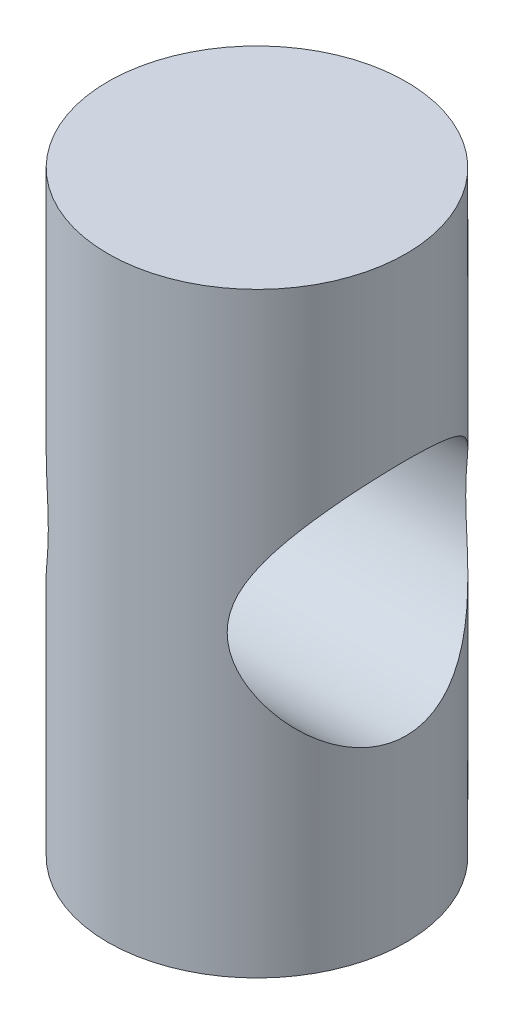
ISO-10303-21;
HEADER;
FILE_DESCRIPTION(('STEP AP214'),'2;1');
FILE_NAME('part.step','',(''),(''),'','','');
FILE_SCHEMA(('AUTOMOTIVE_DESIGN { 1 0 10303 214 1 1 1 1 }'));
ENDSEC;
DATA;
#1=APPLICATION_CONTEXT('core data for automotive mechanical design processes');
#2=APPLICATION_PROTOCOL_DEFINITION('international standard','automotive_design',2000,#1);
#3=PRODUCT_CONTEXT('',#1,'mechanical');
#4=PRODUCT('Part','Part','',(#3));
#5=PRODUCT_RELATED_PRODUCT_CATEGORY('part','',(#4));
#6=PRODUCT_DEFINITION_FORMATION('','',#4);
#7=PRODUCT_DEFINITION_CONTEXT('part definition',#1,'design');
#8=PRODUCT_DEFINITION('design','',#6,#7);
#9=PRODUCT_DEFINITION_SHAPE('','',#8);
#10=(LENGTH_UNIT() NAMED_UNIT(*) SI_UNIT(.MILLI.,.METRE.));
#11=(NAMED_UNIT(*) PLANE_ANGLE_UNIT() SI_UNIT($,.RADIAN.));
#12=(NAMED_UNIT(*) SI_UNIT($,.STERADIAN.) SOLID_ANGLE_UNIT());
#13=UNCERTAINTY_MEASURE_WITH_UNIT(LENGTH_MEASURE(1.E-05),#10,'distance_accuracy_value','');
#14=(GEOMETRIC_REPRESENTATION_CONTEXT(3) GLOBAL_UNCERTAINTY_ASSIGNED_CONTEXT((#13)) GLOBAL_UNIT_ASSIGNED_CONTEXT((#10,
#11,#12)) REPRESENTATION_CONTEXT('',''));
#15=CARTESIAN_POINT('',(0.,0.,0.));
#16=DIRECTION('',(0.,0.,1.));
#17=DIRECTION('',(1.,0.,0.));
#18=AXIS2_PLACEMENT_3D('',#15,#16,#17);
#19=CARTESIAN_POINT('',(0.,20.,0.));
#20=DIRECTION('',(0.,-1.,0.));
#21=DIRECTION('',(0.,0.,-1.));
#22=AXIS2_PLACEMENT_3D('',#19,#20,#21);
#23=CYLINDRICAL_SURFACE('',#22,5.);
#24=CARTESIAN_POINT('',(0.,20.,0.));
#25=DIRECTION('',(0.,1.,0.));
#26=DIRECTION('',(0.,0.,1.));
#27=AXIS2_PLACEMENT_3D('',#24,#25,#26);
#28=CIRCLE('',#27,5.);
#29=CARTESIAN_POINT('',(0.,20.,5.));
#30=VERTEX_POINT('',#29);
#31=EDGE_CURVE('E52',#30,#30,#28,.T.);
#32=ORIENTED_EDGE('',*,*,#31,.F.);
#33=EDGE_LOOP('',(#32));
#34=FACE_BOUND('',#33,.T.);
#35=CARTESIAN_POINT('',(0.,0.,0.));
#36=DIRECTION('',(0.,1.,0.));
#37=DIRECTION('',(0.,0.,1.));
#38=AXIS2_PLACEMENT_3D('',#35,#36,#37);
#39=CIRCLE('',#38,5.);
#40=CARTESIAN_POINT('',(0.,0.,5.));
#41=VERTEX_POINT('',#40);
#42=EDGE_CURVE('E56',#41,#41,#39,.T.);
#43=ORIENTED_EDGE('',*,*,#42,.T.);
#44=EDGE_LOOP('',(#43));
#45=FACE_BOUND('',#44,.T.);
#46=CARTESIAN_POINT('',(-3.,10.,4.));
#47=CARTESIAN_POINT('',(-3.00000216897706,10.0751127638724,3.99999906153736));
#48=CARTESIAN_POINT('',(-3.00283772099951,10.1502548783052,3.9978772461753));
#49=CARTESIAN_POINT('',(-3.01402583978567,10.2999085668623,3.9894472679785));
#50=CARTESIAN_POINT('',(-3.0223821685803,10.3744196759087,3.98313625047582));
#51=CARTESIAN_POINT('',(-3.05522921920833,10.5964792669388,3.95807727295162));
#52=CARTESIAN_POINT('',(-3.08749551829531,10.7422441090253,3.93320424396426));
#53=CARTESIAN_POINT('',(-3.18155216304268,11.0752679296061,3.85777127536566));
#54=CARTESIAN_POINT('',(-3.24971322017135,11.259280762929,3.80127986277753));
#55=CARTESIAN_POINT('',(-3.40189644530756,11.6119405436592,3.66572012951488));
#56=CARTESIAN_POINT('',(-3.48596308623154,11.7805423920404,3.58658817896458));
#57=CARTESIAN_POINT('',(-3.63299455510025,12.0511025805113,3.43637278534429));
#58=CARTESIAN_POINT('',(-3.69414368347801,12.1571725729423,3.37076459378184));
#59=CARTESIAN_POINT('',(-3.81759266309352,12.3623609148689,3.23028207033377));
#60=CARTESIAN_POINT('',(-3.87989292049062,12.4614767491437,3.15540441260616));
#61=CARTESIAN_POINT('',(-4.00378958470973,12.6524698551693,2.99663184861433));
#62=CARTESIAN_POINT('',(-4.06538665380558,12.7443545190937,2.91274636380755));
#63=CARTESIAN_POINT('',(-4.1863923788989,12.9206130185108,2.73598294461542));
#64=CARTESIAN_POINT('',(-4.24580074475847,13.0049858603096,2.64310382389854));
#65=CARTESIAN_POINT('',(-4.39576497816678,13.2141641345422,2.38958702931893));
#66=CARTESIAN_POINT('',(-4.48348070331291,13.3326403995927,2.22188522507707));
#67=CARTESIAN_POINT('',(-4.64331594269541,13.5447440666598,1.86487183658862));
#68=CARTESIAN_POINT('',(-4.71545966061736,13.6384100836688,1.67559449748563));
#69=CARTESIAN_POINT('',(-4.82831023596969,13.7834234169018,1.3106378083364));
#70=CARTESIAN_POINT('',(-4.87221400973622,13.8391644582378,1.13770814774397));
#71=CARTESIAN_POINT('',(-4.94171895740111,13.9269980610548,0.782375130146827));
#72=CARTESIAN_POINT('',(-4.96733014065903,13.9591035557558,0.599977012805128));
#73=CARTESIAN_POINT('',(-4.99815918603462,13.9977160060242,0.230096932996539));
#74=CARTESIAN_POINT('',(-5.00330644418758,14.0041343370861,0.0425996130134308));
#75=CARTESIAN_POINT('',(-4.99253877415278,13.9906715785491,-0.330832803126787));
#76=CARTESIAN_POINT('',(-4.97662287125135,13.9707892718684,-0.516767826586739));
#77=CARTESIAN_POINT('',(-4.92656730161909,13.9078640154556,-0.871367119528871));
#78=CARTESIAN_POINT('',(-4.89346809374314,13.8661423628863,-1.04042037317327));
#79=CARTESIAN_POINT('',(-4.81208987661318,13.7626095346981,-1.36834372900708));
#80=CARTESIAN_POINT('',(-4.76380703714184,13.7007932898918,-1.52721124956009));
#81=CARTESIAN_POINT('',(-4.6497244388944,13.5527986018509,-1.84705463504236));
#82=CARTESIAN_POINT('',(-4.58268531292501,13.4648469677435,-2.00675938549036));
#83=CARTESIAN_POINT('',(-4.43788087321013,13.2709242810442,-2.30941782762204));
#84=CARTESIAN_POINT('',(-4.36010955958914,13.1649431412106,-2.4523620660043));
#85=CARTESIAN_POINT('',(-4.18107021951004,12.9138762624791,-2.7485304270312));
#86=CARTESIAN_POINT('',(-4.07826288579636,12.7652327722589,-2.89780217491636));
#87=CARTESIAN_POINT('',(-3.8698475585256,12.4474881920297,-3.17076769972647));
#88=CARTESIAN_POINT('',(-3.76423628533182,12.2783622400501,-3.29442988804259));
#89=CARTESIAN_POINT('',(-3.56882635257453,11.9375596107156,-3.50457057042853));
#90=CARTESIAN_POINT('',(-3.47848449125888,11.7676981273778,-3.59348348213152));
#91=CARTESIAN_POINT('',(-3.311642115282,11.411267058945,-3.74778213755155));
#92=CARTESIAN_POINT('',(-3.23511152965085,11.2247351281576,-3.81321930924474));
#93=CARTESIAN_POINT('',(-3.12787610334288,10.8944168136814,-3.90124400044661));
#94=CARTESIAN_POINT('',(-3.09031204063763,10.754774407918,-3.93080589266452));
#95=CARTESIAN_POINT('',(-3.03334609209689,10.4696395185338,-3.97493954411983));
#96=CARTESIAN_POINT('',(-3.01390372218814,10.3241608358987,-3.98954472407251));
#97=CARTESIAN_POINT('',(-2.99655581152985,10.0302735019019,-4.00259995644497));
#98=CARTESIAN_POINT('',(-2.99877509004065,9.88185279352365,-4.00095637919488));
#99=CARTESIAN_POINT('',(-3.0246091025562,9.58790438492497,-3.98145195095297));
#100=CARTESIAN_POINT('',(-3.04825402601149,9.44238106298878,-3.96356821696024));
#101=CARTESIAN_POINT('',(-3.12103026774741,9.12187811577489,-3.90662980025043));
#102=CARTESIAN_POINT('',(-3.17511484339329,8.94882232992988,-3.86334682887901));
#103=CARTESIAN_POINT('',(-3.30045577188711,8.61539934501899,-3.7568227830305));
#104=CARTESIAN_POINT('',(-3.3717631685811,8.45507178166204,-3.69352220593005));
#105=CARTESIAN_POINT('',(-3.50285579501049,8.18907447789113,-3.56873529200273));
#106=CARTESIAN_POINT('',(-3.56053707787215,8.08035469635564,-3.5113936535288));
#107=CARTESIAN_POINT('',(-3.67845509899156,7.86958262020671,-3.38766369294498));
#108=CARTESIAN_POINT('',(-3.73869287952637,7.76753308895223,-3.32127165613201));
#109=CARTESIAN_POINT('',(-3.859872019447,7.57004388124776,-3.17963685728911));
#110=CARTESIAN_POINT('',(-3.92081401406668,7.4746108221193,-3.10438543197556));
#111=CARTESIAN_POINT('',(-4.04175247615808,7.29065278420014,-2.9452042144371));
#112=CARTESIAN_POINT('',(-4.10174909000274,7.20212672744487,-2.86127578119157));
#113=CARTESIAN_POINT('',(-4.22021627080502,7.03114906047696,-2.68353213742299));
#114=CARTESIAN_POINT('',(-4.27865261127786,6.94880277661424,-2.5895923964421));
#115=CARTESIAN_POINT('',(-4.39166054074384,6.79225720510719,-2.39294409088257));
#116=CARTESIAN_POINT('',(-4.44623152443021,6.71805919246809,-2.2902341584402));
#117=CARTESIAN_POINT('',(-4.54992450745379,6.5788949795032,-2.07659269983667));
#118=CARTESIAN_POINT('',(-4.59906106720031,6.51390397270302,-1.96568453999991));
#119=CARTESIAN_POINT('',(-4.69058814238978,6.39401717542559,-1.73599312724423));
#120=CARTESIAN_POINT('',(-4.73298247555986,6.33911566909704,-1.61721438534432));
#121=CARTESIAN_POINT('',(-4.82322056507458,6.22306583384218,-1.3291396214626));
#122=CARTESIAN_POINT('',(-4.86768700006943,6.16657783874109,-1.15683679137341));
#123=CARTESIAN_POINT('',(-4.93844243001732,6.07712314701222,-0.802710516835248));
#124=CARTESIAN_POINT('',(-4.96474530068643,6.04413849482907,-0.620894454329593));
#125=CARTESIAN_POINT('',(-4.99709091896648,6.00361774014065,-0.251928169863223));
#126=CARTESIAN_POINT('',(-5.00305974169112,5.99617449327453,-0.0647609739930188));
#127=CARTESIAN_POINT('',(-4.99397521901685,6.00753211507581,0.308260451752381));
#128=CARTESIAN_POINT('',(-4.97892039336181,6.02633483169779,0.494114588250199));
#129=CARTESIAN_POINT('',(-4.9304799780731,6.08720730726,0.848969594728801));
#130=CARTESIAN_POINT('',(-4.89811800019639,6.12797868293325,1.01834018003764));
#131=CARTESIAN_POINT('',(-4.81810404518646,6.2297068224953,1.34704122291859));
#132=CARTESIAN_POINT('',(-4.77044810811758,6.2906688143008,1.50636906741201));
#133=CARTESIAN_POINT('',(-4.65772424604643,6.43674894379435,1.82676698607757));
#134=CARTESIAN_POINT('',(-4.59144870858767,6.52358705321838,1.98661951413852));
#135=CARTESIAN_POINT('',(-4.44806715123531,6.7152853055309,2.28972858505142));
#136=CARTESIAN_POINT('',(-4.37095538500458,6.82015501702622,2.43297624848929));
#137=CARTESIAN_POINT('',(-4.19334053560393,7.06858955779301,2.72976152486729));
#138=CARTESIAN_POINT('',(-4.09128024292157,7.21568109587433,2.87940400752525));
#139=CARTESIAN_POINT('',(-3.8840119778562,7.53024559529154,3.15339914395294));
#140=CARTESIAN_POINT('',(-3.77880023252429,7.69774378848213,3.2777199709751));
#141=CARTESIAN_POINT('',(-3.62927982065267,7.95646536311241,3.43993958125246));
#142=CARTESIAN_POINT('',(-3.58277064491091,8.04001997010147,3.48824759185101));
#143=CARTESIAN_POINT('',(-3.49198784457615,8.21135259007398,3.57912761543908));
#144=CARTESIAN_POINT('',(-3.44771451944073,8.29913116573425,3.62169886134499));
#145=CARTESIAN_POINT('',(-3.32016981870037,8.56867868407035,3.74029659813686));
#146=CARTESIAN_POINT('',(-3.24192092894644,8.75707516713469,3.80747088284747));
#147=CARTESIAN_POINT('',(-3.13160451168613,9.09233806168124,3.89828691275497));
#148=CARTESIAN_POINT('',(-3.09272315846936,9.23498946694964,3.92892882070587));
#149=CARTESIAN_POINT('',(-3.04855095693216,9.45340832619082,3.96316402261263));
#150=CARTESIAN_POINT('',(-3.03619187391989,9.52685989967015,3.97261660358216));
#151=CARTESIAN_POINT('',(-3.01668227593599,9.67483847109559,3.98745340408319));
#152=CARTESIAN_POINT('',(-3.00952811408349,9.74936467867818,3.99284047225642));
#153=CARTESIAN_POINT('',(-3.00343793345697,9.85338182067805,3.99741959341137));
#154=CARTESIAN_POINT('',(-3.00215019354812,9.88267880661877,3.99838660813179));
#155=CARTESIAN_POINT('',(-3.00043074741308,9.94131569844635,3.99967703663994));
#156=CARTESIAN_POINT('',(-2.99999915264322,9.97065560942388,4.00000036663029));
#157=CARTESIAN_POINT('',(-3.,10.,4.));
#158=B_SPLINE_CURVE_WITH_KNOTS('',3,(#46,#47,#48,#49,#50,#51,#52,#53,#54,#55,#56,#57,#58,#59,
#60,#61,#62,#63,#64,#65,#66,#67,#68,#69,#70,#71,#72,#73,#74,#75,#76,#77,#78,#79,#80,#81,#82,#83,
#84,#85,#86,#87,#88,#89,#90,#91,#92,#93,#94,#95,#96,#97,#98,#99,#100,#101,#102,#103,#104,#105,
#106,#107,#108,#109,#110,#111,#112,#113,#114,#115,#116,#117,#118,#119,#120,#121,#122,#123,#124,
#125,#126,#127,#128,#129,#130,#131,#132,#133,#134,#135,#136,#137,#138,#139,#140,#141,#142,#143,
#144,#145,#146,#147,#148,#149,#150,#151,#152,#153,#154,#155,#156,#157),.UNSPECIFIED.,.T.,.F.,(4,
2,2,2,2,2,2,2,2,2,2,2,2,2,2,2,2,2,2,2,2,2,2,2,2,2,2,2,2,2,2,2,2,2,2,2,2,2,2,2,2,2,2,2,2,2,2,2,2,
2,2,2,2,2,2,4),(0.,0.225303149807231,0.450759986838272,0.902589537001555,1.51190711853316,
2.12295426111056,2.53921883623536,2.95563320042537,3.37161619465101,3.78765413525724,
4.45477512810166,5.12085162154028,5.67923095322337,6.23730451573862,6.79730186307842,
7.35732512562407,7.88682741454582,8.41646338281239,8.99711927828841,9.57810111704287,
10.2788135954479,10.9803852999411,11.6143729322192,12.2469630912607,12.6881435902171,
13.1283361077291,13.5710666035102,14.0144218930567,14.5705602720657,15.1283675704704,
15.5352238321967,15.942247592246,16.3496727250838,16.7570341440244,17.1702378198689,
17.5835060601354,17.9956387441516,18.4075372242806,18.9651425713466,19.5223214735685,
20.0815238628587,20.6407656270703,21.1700928587455,21.6995572553744,22.2782911959238,
22.8573331992423,23.5548944002191,24.2533270266164,24.5745079263911,24.8957317299052,
25.5365329660934,25.9876445768306,26.2126360623764,26.4374697531347,26.5254777394982,
26.6134971823349),.UNSPECIFIED.);
#159=CARTESIAN_POINT('',(-3.,10.,4.));
#160=VERTEX_POINT('',#159);
#161=EDGE_CURVE('E48',#160,#160,#158,.T.);
#162=ORIENTED_EDGE('',*,*,#161,.F.);
#163=EDGE_LOOP('',(#162));
#164=FACE_BOUND('',#163,.T.);
#165=CARTESIAN_POINT('',(5.,6.,0.));
#166=CARTESIAN_POINT('',(4.99999925007144,6.00000076765392,-0.0960463892269616));
#167=CARTESIAN_POINT('',(4.99722609178681,6.00346570128462,-0.192107536101775));
#168=CARTESIAN_POINT('',(4.98619644135893,6.01726581879289,-0.383456997959251));
#169=CARTESIAN_POINT('',(4.97793704739464,6.02760463846066,-0.478744876926666));
#170=CARTESIAN_POINT('',(4.95610616327994,6.05499588301476,-0.667896097153801));
#171=CARTESIAN_POINT('',(4.94252601634641,6.07205924889984,-0.761756856675558));
#172=CARTESIAN_POINT('',(4.91036147054021,6.11261018696222,-0.947221840714973));
#173=CARTESIAN_POINT('',(4.89177480177176,6.13610067319362,-1.0388250210609));
#174=CARTESIAN_POINT('',(4.82935106483283,6.21533299425757,-1.30807557979516));
#175=CARTESIAN_POINT('',(4.77867586050698,6.28005103387382,-1.48159866642755));
#176=CARTESIAN_POINT('',(4.66270676226574,6.43025035599326,-1.81389737735533));
#177=CARTESIAN_POINT('',(4.59741282203946,6.51573170427287,-1.97267295492965));
#178=CARTESIAN_POINT('',(4.47912821132765,6.67368686451008,-2.2248639292531));
#179=CARTESIAN_POINT('',(4.42904400352648,6.74134736434557,-2.32274021976622));
#180=CARTESIAN_POINT('',(4.3251620211011,6.88400573391444,-2.51087921896427));
#181=CARTESIAN_POINT('',(4.2713642727544,6.95900355172956,-2.60114198151347));
#182=CARTESIAN_POINT('',(4.16107388762878,7.1159636745199,-2.77417073320715));
#183=CARTESIAN_POINT('',(4.10457375863138,7.1979459007938,-2.85691378598488));
#184=CARTESIAN_POINT('',(3.99026026433187,7.36823979836874,-3.01451382114098));
#185=CARTESIAN_POINT('',(3.93244741410357,7.45654901548431,-3.08937383375154));
#186=CARTESIAN_POINT('',(3.81587933402462,7.64074063185359,-3.23229007730866));
#187=CARTESIAN_POINT('',(3.75712363418718,7.73672057263845,-3.30022025313705));
#188=CARTESIAN_POINT('',(3.64112939088146,7.93498324744234,-3.42776995071922));
#189=CARTESIAN_POINT('',(3.58389133165286,8.03726795934745,-3.48738684516028));
#190=CARTESIAN_POINT('',(3.47300406561232,8.247927510792,-3.59782503741137));
#191=CARTESIAN_POINT('',(3.41934539082209,8.35628476493175,-3.64867015372864));
#192=CARTESIAN_POINT('',(3.31787465098284,8.57938269970485,-3.74117870293954));
#193=CARTESIAN_POINT('',(3.27005760650691,8.69411782069289,-3.78284998029722));
#194=CARTESIAN_POINT('',(3.17670210665408,8.94771042607503,-3.86171422877733));
#195=CARTESIAN_POINT('',(3.1325716319431,9.08761069930919,-3.89730775139992));
#196=CARTESIAN_POINT('',(3.06140069934777,9.37443811329645,-3.95346969661508));
#197=CARTESIAN_POINT('',(3.03431824876937,9.52134702148413,-3.97407505769532));
#198=CARTESIAN_POINT('',(3.00168390937591,9.82038133127045,-3.99879637912877));
#199=CARTESIAN_POINT('',(2.99632180499322,9.97254104739483,-4.00276700147493));
#200=CARTESIAN_POINT('',(3.00879937970708,10.2754117079388,-3.99338954471176));
#201=CARTESIAN_POINT('',(3.02665869488164,10.4261213175347,-3.98002680850315));
#202=CARTESIAN_POINT('',(3.08641470165092,10.7444399948995,-3.93390695839724));
#203=CARTESIAN_POINT('',(3.13163820874367,10.9109987003219,-3.89843994454065));
#204=CARTESIAN_POINT('',(3.23994782689821,11.2330884824285,-3.8088871552876));
#205=CARTESIAN_POINT('',(3.30308674578672,11.388585232108,-3.75474623305131));
#206=CARTESIAN_POINT('',(3.42227632742624,11.6497837139866,-3.6459308316069));
#207=CARTESIAN_POINT('',(3.4760534543827,11.7581007886366,-3.59488537286134));
#208=CARTESIAN_POINT('',(3.5870318510308,11.9684490944712,-3.48415594475936));
#209=CARTESIAN_POINT('',(3.64423469607952,12.0704773892381,-3.42446798287777));
#210=CARTESIAN_POINT('',(3.76020626520278,12.2683872018107,-3.29671153239115));
#211=CARTESIAN_POINT('',(3.81897674116778,12.3642613966168,-3.22863333111246));
#212=CARTESIAN_POINT('',(3.93645333893041,12.5496673500319,-3.08431402129276));
#213=CARTESIAN_POINT('',(3.99515946971116,12.639200147583,-3.00807425506497));
#214=CARTESIAN_POINT('',(4.11270704931929,12.8140101235963,-2.84534419554463));
#215=CARTESIAN_POINT('',(4.17150999123006,12.8991090406098,-2.75863401138672));
#216=CARTESIAN_POINT('',(4.28625477779832,13.0619130937561,-2.57673993184819));
#217=CARTESIAN_POINT('',(4.34219619990716,13.1396171393685,-2.48155479066094));
#218=CARTESIAN_POINT('',(4.44974832295432,13.2867573053731,-2.28307653193498));
#219=CARTESIAN_POINT('',(4.50136864734377,13.3562119507816,-2.17980247969448));
#220=CARTESIAN_POINT('',(4.59904750487202,13.4861249415168,-1.96536649556131));
#221=CARTESIAN_POINT('',(4.64510854627346,13.5465873468848,-1.85420815715068));
#222=CARTESIAN_POINT('',(4.7484549444979,13.6810867237149,-1.5756005587103));
#223=CARTESIAN_POINT('',(4.80222795480343,13.7500220999001,-1.40425498615803));
#224=CARTESIAN_POINT('',(4.86955008764638,13.8357293521389,-1.13837354893344));
#225=CARTESIAN_POINT('',(4.8897706493769,13.8613525356034,-1.04825004232709));
#226=CARTESIAN_POINT('',(4.92539137425732,13.9063630582772,-0.865540559816896));
#227=CARTESIAN_POINT('',(4.94079379010376,13.9257533117745,-0.772955756713173));
#228=CARTESIAN_POINT('',(4.96651844615635,13.9580805109284,-0.585412597793517));
#229=CARTESIAN_POINT('',(4.97681103690025,13.9709797988717,-0.490443672775502));
#230=CARTESIAN_POINT('',(4.99194513088726,13.9899309236985,-0.299430031813101));
#231=CARTESIAN_POINT('',(4.99678887106583,13.9959855705412,-0.203385773695788));
#232=CARTESIAN_POINT('',(5.00091325383537,14.0011418998756,-0.0109789194594068));
#233=CARTESIAN_POINT('',(5.00019354569613,14.0002431440118,0.0853836963467356));
#234=CARTESIAN_POINT('',(4.9932177293551,13.9915194220691,0.277564076275664));
#235=CARTESIAN_POINT('',(4.9869619042872,13.9836948101995,0.373381868010197));
#236=CARTESIAN_POINT('',(4.96153018407961,13.9518293985393,0.643376202108306));
#237=CARTESIAN_POINT('',(4.93592517140712,13.9197003154007,0.816090326301517));
#238=CARTESIAN_POINT('',(4.86835214152081,13.8342569725143,1.15270281500897));
#239=CARTESIAN_POINT('',(4.82637926825896,13.7809364255526,1.31659854682907));
#240=CARTESIAN_POINT('',(4.72579643945096,13.6516988659432,1.64246254984513));
#241=CARTESIAN_POINT('',(4.66631810673483,13.5745883227446,1.80368475821043));
#242=CARTESIAN_POINT('',(4.53567260245268,13.4022758020823,2.11082248971804));
#243=CARTESIAN_POINT('',(4.4645048479924,13.3070729224052,2.25673724895787));
#244=CARTESIAN_POINT('',(4.29987369953562,13.0815513267087,2.55850389863));
#245=CARTESIAN_POINT('',(4.20473938172851,12.9479966072965,2.71101415405668));
#246=CARTESIAN_POINT('',(4.00886997355526,12.6612260866735,2.99307397629789));
#247=CARTESIAN_POINT('',(3.90811942507611,12.5079543318471,3.1225555991596));
#248=CARTESIAN_POINT('',(3.74748270315101,12.2471311101696,3.31136973153524));
#249=CARTESIAN_POINT('',(3.68709486880245,12.1452788111765,3.37827483148951));
#250=CARTESIAN_POINT('',(3.56870831535753,11.9347554845189,3.50310004274981));
#251=CARTESIAN_POINT('',(3.51071087553711,11.8260808822575,3.5610153876826));
#252=CARTESIAN_POINT('',(3.39966227027329,11.602221488468,3.66717546897681));
#253=CARTESIAN_POINT('',(3.34659439233027,11.4870609917569,3.71545356957107));
#254=CARTESIAN_POINT('',(3.24818077497366,11.2499190098446,3.80178930968629));
#255=CARTESIAN_POINT('',(3.20282553589751,11.1279461651776,3.83985955607521));
#256=CARTESIAN_POINT('',(3.12038840866386,10.8678265775587,3.90720331142187));
#257=CARTESIAN_POINT('',(3.08419433480729,10.7291546803849,3.93559119413991));
#258=CARTESIAN_POINT('',(3.02986743136531,10.4463247642843,3.9775781127465));
#259=CARTESIAN_POINT('',(3.01168904830204,10.3021815440949,3.9912144566024));
#260=CARTESIAN_POINT('',(2.99649473343137,10.0113026041562,4.00264117924986));
#261=CARTESIAN_POINT('',(2.9995925091774,9.86455714184094,4.00034641568718));
#262=CARTESIAN_POINT('',(3.02661544312574,9.574031563725,3.97993037076082));
#263=CARTESIAN_POINT('',(3.05057362163064,9.43025651940554,3.96178399745347));
#264=CARTESIAN_POINT('',(3.12414149092464,9.1107866882603,3.90415501142106));
#265=CARTESIAN_POINT('',(3.17898498230063,8.93715483124829,3.86018501383219));
#266=CARTESIAN_POINT('',(3.3057783394867,8.60273204343612,3.75216313748641));
#267=CARTESIAN_POINT('',(3.37777844742744,8.44198071561927,3.68805209792862));
#268=CARTESIAN_POINT('',(3.50982146216506,8.17564971618661,3.56189718857294));
#269=CARTESIAN_POINT('',(3.56777397494364,8.06697526240992,3.50405339937571));
#270=CARTESIAN_POINT('',(3.6861580294968,7.85631901745117,3.37929393177908));
#271=CARTESIAN_POINT('',(3.74659057258539,7.75433997361939,3.31237456346964));
#272=CARTESIAN_POINT('',(3.86808457920661,7.55702721371118,3.16965616428089));
#273=CARTESIAN_POINT('',(3.92914658654707,7.46169991435871,3.09384874323809));
#274=CARTESIAN_POINT('',(4.05025163189585,7.27799629891716,2.93352249741475));
#275=CARTESIAN_POINT('',(4.11029482922853,7.18961888798019,2.84900504963131));
#276=CARTESIAN_POINT('',(4.22871182009361,7.01909175167096,2.67014072502321));
#277=CARTESIAN_POINT('',(4.28705303147616,6.93703985178251,2.57567862987888));
#278=CARTESIAN_POINT('',(4.39979346035996,6.78113700752819,2.37797638733421));
#279=CARTESIAN_POINT('',(4.45419202301451,6.70728742443083,2.27473478787951));
#280=CARTESIAN_POINT('',(4.55747526770647,6.56886342757591,2.05999159425818));
#281=CARTESIAN_POINT('',(4.6063729651901,6.50426701664687,1.94851057794573));
#282=CARTESIAN_POINT('',(4.69732670360689,6.38525989555939,1.71770987957304));
#283=CARTESIAN_POINT('',(4.73938692977709,6.33084295142021,1.59839505588519));
#284=CARTESIAN_POINT('',(4.82841831850648,6.21643818442393,1.31004257426742));
#285=CARTESIAN_POINT('',(4.87206678940944,6.16101963722832,1.13806652982952));
#286=CARTESIAN_POINT('',(4.92393545570556,6.09547597342901,0.873484823698006));
#287=CARTESIAN_POINT('',(4.93895148645559,6.07656639714577,0.784257476388357));
#288=CARTESIAN_POINT('',(4.96420704257137,6.04482021925184,0.604069275433988));
#289=CARTESIAN_POINT('',(4.97444869413618,6.03198091429947,0.51310921224965));
#290=CARTESIAN_POINT('',(4.98810319960311,6.01487864440111,0.351776460100333));
#291=CARTESIAN_POINT('',(4.99255849534678,6.00930516590387,0.281625512428738));
#292=CARTESIAN_POINT('',(4.99850750025309,6.00186514956671,0.140985741127494));
#293=CARTESIAN_POINT('',(5.00000055043816,5.99999943655165,0.0704968458136378));
#294=CARTESIAN_POINT('',(5.,6.,0.));
#295=B_SPLINE_CURVE_WITH_KNOTS('',3,(#165,#166,#167,#168,#169,#170,#171,#172,#173,#174,#175,
#176,#177,#178,#179,#180,#181,#182,#183,#184,#185,#186,#187,#188,#189,#190,#191,#192,#193,#194,
#195,#196,#197,#198,#199,#200,#201,#202,#203,#204,#205,#206,#207,#208,#209,#210,#211,#212,#213,
#214,#215,#216,#217,#218,#219,#220,#221,#222,#223,#224,#225,#226,#227,#228,#229,#230,#231,#232,
#233,#234,#235,#236,#237,#238,#239,#240,#241,#242,#243,#244,#245,#246,#247,#248,#249,#250,#251,
#252,#253,#254,#255,#256,#257,#258,#259,#260,#261,#262,#263,#264,#265,#266,#267,#268,#269,#270,
#271,#272,#273,#274,#275,#276,#277,#278,#279,#280,#281,#282,#283,#284,#285,#286,#287,#288,#289,
#290,#291,#292,#293,#294),.UNSPECIFIED.,.T.,.F.,(4,2,2,2,2,2,2,2,2,2,2,2,2,2,2,2,2,2,2,2,2,2,2,
2,2,2,2,2,2,2,2,2,2,2,2,2,2,2,2,2,2,2,2,2,2,2,2,2,2,2,2,2,2,2,2,2,2,2,2,2,2,2,2,2,4),(0.,
0.288062758667622,0.576278003111146,0.864964129651048,1.15378136390405,1.72709009312658,
2.30040063856698,2.68722645474264,3.07404953396829,3.46201544535746,3.84983167444716,
4.24376978737867,4.63783211891323,5.03080698743563,5.42344451024555,5.87474837856561,
6.32493619990523,6.7790492217582,7.23354649231948,7.75923125238323,8.28648192165713,
8.6798007428228,9.07330184628004,9.46726282862533,9.86115911639957,10.2656076837238,
10.6701158028798,11.0736976518487,11.4770967247701,12.0514034064526,12.3386733158201,
12.6258087123431,12.9145912709401,13.2032552313199,13.4919373897649,13.7806047849779,
14.3106110383656,14.8407746547939,15.4037260006338,15.9667054266295,16.6361816844955,
17.3076015388324,17.7152021542886,18.1230181470314,18.5293968097803,18.9352712520426,
19.3719136407629,19.8074491211247,20.2453140663445,20.6838733784182,21.242737078473,
21.8032579383456,22.2109901693715,22.6188886741924,23.0271753760054,23.4353976291479,
23.8490189589149,24.2627088316335,24.675398328476,25.0878342578458,25.6427442660391,
25.9197834242688,26.1966990890726,26.4080865235327,26.6195209777156),.UNSPECIFIED.);
#296=CARTESIAN_POINT('',(5.,6.,0.));
#297=VERTEX_POINT('',#296);
#298=EDGE_CURVE('E10',#297,#297,#295,.T.);
#299=ORIENTED_EDGE('',*,*,#298,.F.);
#300=EDGE_LOOP('',(#299));
#301=FACE_BOUND('',#300,.T.);
#302=ADVANCED_FACE('F37',(#34,#45,#164,#301),#23,.T.);
#303=CARTESIAN_POINT('',(0.,20.,0.));
#304=DIRECTION('',(0.,1.,0.));
#305=DIRECTION('',(0.,0.,1.));
#306=AXIS2_PLACEMENT_3D('',#303,#304,#305);
#307=PLANE('',#306);
#308=ORIENTED_EDGE('',*,*,#31,.T.);
#309=EDGE_LOOP('',(#308));
#310=FACE_BOUND('',#309,.T.);
#311=ADVANCED_FACE('F67',(#310),#307,.T.);
#312=CARTESIAN_POINT('',(0.,0.,0.));
#313=DIRECTION('',(0.,1.,0.));
#314=DIRECTION('',(0.,0.,1.));
#315=AXIS2_PLACEMENT_3D('',#312,#313,#314);
#316=PLANE('',#315);
#317=ORIENTED_EDGE('',*,*,#42,.F.);
#318=EDGE_LOOP('',(#317));
#319=FACE_BOUND('',#318,.T.);
#320=ADVANCED_FACE('F66',(#319),#316,.F.);
#321=CARTESIAN_POINT('',(5.,10.,0.));
#322=DIRECTION('',(-1.,0.,0.));
#323=DIRECTION('',(0.,0.,1.));
#324=AXIS2_PLACEMENT_3D('',#321,#322,#323);
#325=CYLINDRICAL_SURFACE('',#324,4.);
#326=ORIENTED_EDGE('',*,*,#161,.T.);
#327=EDGE_LOOP('',(#326));
#328=FACE_BOUND('',#327,.T.);
#329=ORIENTED_EDGE('',*,*,#298,.T.);
#330=EDGE_LOOP('',(#329));
#331=FACE_BOUND('',#330,.T.);
#332=ADVANCED_FACE('F62',(#328,#331),#325,.F.);
#333=CLOSED_SHELL('',(#302,#311,#320,#332));
#334=MANIFOLD_SOLID_BREP('B2',#333);
#335=ADVANCED_BREP_SHAPE_REPRESENTATION('',(#18,#334),#14);
#336=SHAPE_DEFINITION_REPRESENTATION(#9,#335);
ENDSEC;
END-ISO-10303-21;
